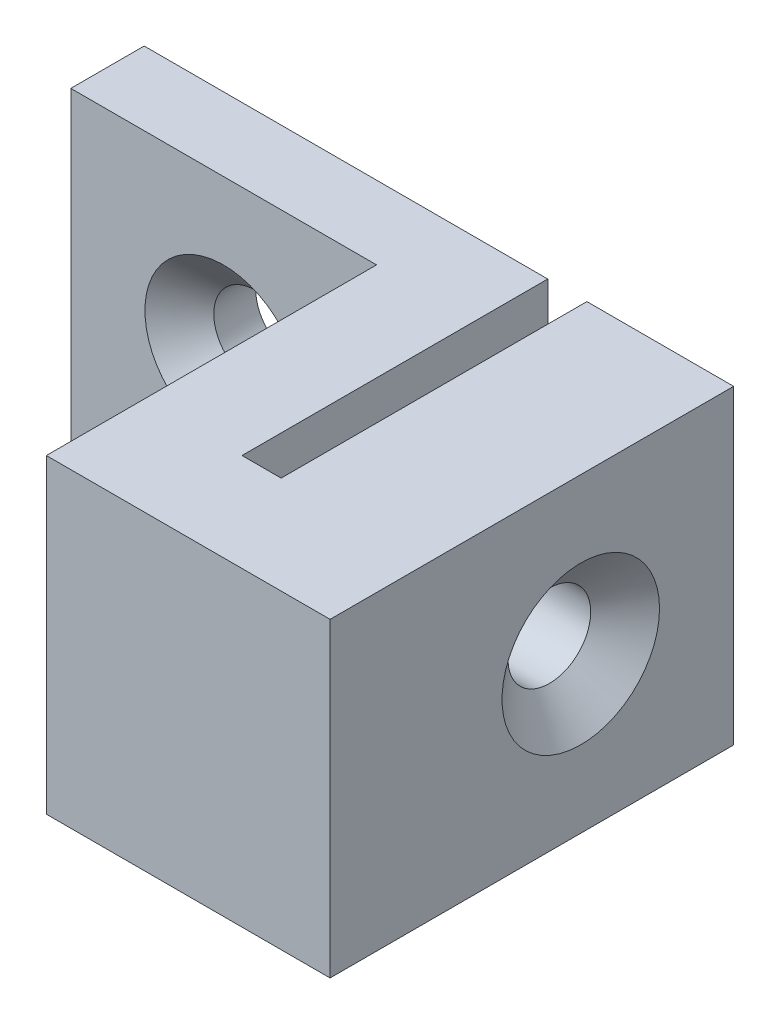
ISO-10303-21;
HEADER;
FILE_DESCRIPTION(('STEP AP214'),'2;1');
FILE_NAME('part.step','',(''),(''),'','','');
FILE_SCHEMA(('AUTOMOTIVE_DESIGN { 1 0 10303 214 1 1 1 1 }'));
ENDSEC;
DATA;
#1=APPLICATION_CONTEXT('core data for automotive mechanical design processes');
#2=APPLICATION_PROTOCOL_DEFINITION('international standard','automotive_design',2000,#1);
#3=PRODUCT_CONTEXT('',#1,'mechanical');
#4=PRODUCT('Part','Part','',(#3));
#5=PRODUCT_RELATED_PRODUCT_CATEGORY('part','',(#4));
#6=PRODUCT_DEFINITION_FORMATION('','',#4);
#7=PRODUCT_DEFINITION_CONTEXT('part definition',#1,'design');
#8=PRODUCT_DEFINITION('design','',#6,#7);
#9=PRODUCT_DEFINITION_SHAPE('','',#8);
#10=(LENGTH_UNIT() NAMED_UNIT(*) SI_UNIT(.MILLI.,.METRE.));
#11=(NAMED_UNIT(*) PLANE_ANGLE_UNIT() SI_UNIT($,.RADIAN.));
#12=(NAMED_UNIT(*) SI_UNIT($,.STERADIAN.) SOLID_ANGLE_UNIT());
#13=UNCERTAINTY_MEASURE_WITH_UNIT(LENGTH_MEASURE(1.E-05),#10,'distance_accuracy_value','');
#14=(GEOMETRIC_REPRESENTATION_CONTEXT(3) GLOBAL_UNCERTAINTY_ASSIGNED_CONTEXT((#13)) GLOBAL_UNIT_ASSIGNED_CONTEXT((#10,
#11,#12)) REPRESENTATION_CONTEXT('',''));
#15=CARTESIAN_POINT('',(0.,0.,0.));
#16=DIRECTION('',(0.,0.,1.));
#17=DIRECTION('',(1.,0.,0.));
#18=AXIS2_PLACEMENT_3D('',#15,#16,#17);
#19=CARTESIAN_POINT('',(13.6,25.4,8.));
#20=DIRECTION('',(0.,0.,-1.));
#21=DIRECTION('',(-1.,0.,0.));
#22=AXIS2_PLACEMENT_3D('',#19,#20,#21);
#23=PLANE('',#22);
#24=DIRECTION('',(1.,0.,0.));
#25=VECTOR('',#24,1.);
#26=CARTESIAN_POINT('',(13.6,0.,8.));
#27=LINE('',#26,#25);
#28=CARTESIAN_POINT('',(-9.6,0.,8.));
#29=VERTEX_POINT('',#28);
#30=CARTESIAN_POINT('',(13.6,0.,8.));
#31=VERTEX_POINT('',#30);
#32=EDGE_CURVE('E147',#29,#31,#27,.T.);
#33=ORIENTED_EDGE('',*,*,#32,.T.);
#34=DIRECTION('',(0.,-1.,0.));
#35=VECTOR('',#34,1.);
#36=CARTESIAN_POINT('',(13.6,25.4,8.));
#37=LINE('',#36,#35);
#38=CARTESIAN_POINT('',(13.6,25.4,8.));
#39=VERTEX_POINT('',#38);
#40=EDGE_CURVE('E11',#39,#31,#37,.T.);
#41=ORIENTED_EDGE('',*,*,#40,.F.);
#42=DIRECTION('',(1.,0.,0.));
#43=VECTOR('',#42,1.);
#44=CARTESIAN_POINT('',(13.6,25.4,8.));
#45=LINE('',#44,#43);
#46=CARTESIAN_POINT('',(-9.6,25.4,8.));
#47=VERTEX_POINT('',#46);
#48=EDGE_CURVE('E166',#47,#39,#45,.T.);
#49=ORIENTED_EDGE('',*,*,#48,.F.);
#50=DIRECTION('',(0.,-1.,0.));
#51=VECTOR('',#50,1.);
#52=CARTESIAN_POINT('',(-9.6,25.4,8.));
#53=LINE('',#52,#51);
#54=EDGE_CURVE('E143',#47,#29,#53,.T.);
#55=ORIENTED_EDGE('',*,*,#54,.T.);
#56=EDGE_LOOP('',(#33,#41,#49,#55));
#57=FACE_BOUND('',#56,.T.);
#58=ADVANCED_FACE('F37',(#57),#23,.F.);
#59=CARTESIAN_POINT('',(13.6,25.4,-25.));
#60=DIRECTION('',(-1.,0.,0.));
#61=DIRECTION('',(0.,0.,1.));
#62=AXIS2_PLACEMENT_3D('',#59,#60,#61);
#63=PLANE('',#62);
#64=CARTESIAN_POINT('',(13.6,12.7,-12.5));
#65=DIRECTION('',(1.,0.,0.));
#66=DIRECTION('',(0.,0.,-1.));
#67=AXIS2_PLACEMENT_3D('',#64,#65,#66);
#68=CIRCLE('',#67,6.4389);
#69=CARTESIAN_POINT('',(13.6,12.7,-18.9389));
#70=VERTEX_POINT('',#69);
#71=EDGE_CURVE('E422',#70,#70,#68,.T.);
#72=ORIENTED_EDGE('',*,*,#71,.F.);
#73=EDGE_LOOP('',(#72));
#74=FACE_BOUND('',#73,.T.);
#75=DIRECTION('',(0.,0.,-1.));
#76=VECTOR('',#75,1.);
#77=CARTESIAN_POINT('',(13.6,0.,-25.));
#78=LINE('',#77,#76);
#79=CARTESIAN_POINT('',(13.6,0.,-25.));
#80=VERTEX_POINT('',#79);
#81=EDGE_CURVE('E150',#31,#80,#78,.T.);
#82=ORIENTED_EDGE('',*,*,#81,.T.);
#83=DIRECTION('',(0.,-1.,0.));
#84=VECTOR('',#83,1.);
#85=CARTESIAN_POINT('',(13.6,25.4,-25.));
#86=LINE('',#85,#84);
#87=CARTESIAN_POINT('',(13.6,25.4,-25.));
#88=VERTEX_POINT('',#87);
#89=EDGE_CURVE('E46',#88,#80,#86,.T.);
#90=ORIENTED_EDGE('',*,*,#89,.F.);
#91=DIRECTION('',(0.,0.,-1.));
#92=VECTOR('',#91,1.);
#93=CARTESIAN_POINT('',(13.6,25.4,-25.));
#94=LINE('',#93,#92);
#95=EDGE_CURVE('E104',#39,#88,#94,.T.);
#96=ORIENTED_EDGE('',*,*,#95,.F.);
#97=ORIENTED_EDGE('',*,*,#40,.T.);
#98=EDGE_LOOP('',(#82,#90,#96,#97));
#99=FACE_BOUND('',#98,.T.);
#100=ADVANCED_FACE('F240',(#74,#99),#63,.F.);
#101=CARTESIAN_POINT('',(1.6,25.4,-25.));
#102=DIRECTION('',(0.,0.,1.));
#103=DIRECTION('',(1.,0.,0.));
#104=AXIS2_PLACEMENT_3D('',#101,#102,#103);
#105=PLANE('',#104);
#106=DIRECTION('',(-1.,0.,0.));
#107=VECTOR('',#106,1.);
#108=CARTESIAN_POINT('',(1.6,0.,-25.));
#109=LINE('',#108,#107);
#110=CARTESIAN_POINT('',(1.6,0.,-25.));
#111=VERTEX_POINT('',#110);
#112=EDGE_CURVE('E153',#80,#111,#109,.T.);
#113=ORIENTED_EDGE('',*,*,#112,.T.);
#114=DIRECTION('',(0.,-1.,0.));
#115=VECTOR('',#114,1.);
#116=CARTESIAN_POINT('',(1.6,25.4,-25.));
#117=LINE('',#116,#115);
#118=CARTESIAN_POINT('',(1.6,25.4,-25.));
#119=VERTEX_POINT('',#118);
#120=EDGE_CURVE('E179',#119,#111,#117,.T.);
#121=ORIENTED_EDGE('',*,*,#120,.F.);
#122=DIRECTION('',(-1.,0.,0.));
#123=VECTOR('',#122,1.);
#124=CARTESIAN_POINT('',(1.6,25.4,-25.));
#125=LINE('',#124,#123);
#126=EDGE_CURVE('E203',#88,#119,#125,.T.);
#127=ORIENTED_EDGE('',*,*,#126,.F.);
#128=ORIENTED_EDGE('',*,*,#89,.T.);
#129=EDGE_LOOP('',(#113,#121,#127,#128));
#130=FACE_BOUND('',#129,.T.);
#131=ADVANCED_FACE('F244',(#130),#105,.F.);
#132=CARTESIAN_POINT('',(1.6,25.4,0.));
#133=DIRECTION('',(1.,0.,0.));
#134=DIRECTION('',(0.,0.,-1.));
#135=AXIS2_PLACEMENT_3D('',#132,#133,#134);
#136=PLANE('',#135);
#137=CARTESIAN_POINT('',(1.6,12.7,-12.5));
#138=DIRECTION('',(1.,0.,0.));
#139=DIRECTION('',(0.,0.,-1.));
#140=AXIS2_PLACEMENT_3D('',#137,#138,#139);
#141=CIRCLE('',#140,3.3782);
#142=CARTESIAN_POINT('',(1.6,12.7,-15.8782));
#143=VERTEX_POINT('',#142);
#144=EDGE_CURVE('E186',#143,#143,#141,.T.);
#145=ORIENTED_EDGE('',*,*,#144,.T.);
#146=EDGE_LOOP('',(#145));
#147=FACE_BOUND('',#146,.T.);
#148=DIRECTION('',(0.,0.,1.));
#149=VECTOR('',#148,1.);
#150=CARTESIAN_POINT('',(1.6,0.,0.));
#151=LINE('',#150,#149);
#152=CARTESIAN_POINT('',(1.6,0.,0.));
#153=VERTEX_POINT('',#152);
#154=EDGE_CURVE('E155',#111,#153,#151,.T.);
#155=ORIENTED_EDGE('',*,*,#154,.T.);
#156=DIRECTION('',(0.,-1.,0.));
#157=VECTOR('',#156,1.);
#158=CARTESIAN_POINT('',(1.6,25.4,0.));
#159=LINE('',#158,#157);
#160=CARTESIAN_POINT('',(1.6,25.4,0.));
#161=VERTEX_POINT('',#160);
#162=EDGE_CURVE('E176',#161,#153,#159,.T.);
#163=ORIENTED_EDGE('',*,*,#162,.F.);
#164=DIRECTION('',(0.,0.,1.));
#165=VECTOR('',#164,1.);
#166=CARTESIAN_POINT('',(1.6,25.4,0.));
#167=LINE('',#166,#165);
#168=EDGE_CURVE('E205',#119,#161,#167,.T.);
#169=ORIENTED_EDGE('',*,*,#168,.F.);
#170=ORIENTED_EDGE('',*,*,#120,.T.);
#171=EDGE_LOOP('',(#155,#163,#169,#170));
#172=FACE_BOUND('',#171,.T.);
#173=ADVANCED_FACE('F249',(#147,#172),#136,.F.);
#174=CARTESIAN_POINT('',(-1.6,25.4,0.));
#175=DIRECTION('',(0.,0.,1.));
#176=DIRECTION('',(1.,0.,0.));
#177=AXIS2_PLACEMENT_3D('',#174,#175,#176);
#178=PLANE('',#177);
#179=DIRECTION('',(-1.,0.,0.));
#180=VECTOR('',#179,1.);
#181=CARTESIAN_POINT('',(-1.6,0.,0.));
#182=LINE('',#181,#180);
#183=CARTESIAN_POINT('',(-1.6,0.,0.));
#184=VERTEX_POINT('',#183);
#185=EDGE_CURVE('E157',#153,#184,#182,.T.);
#186=ORIENTED_EDGE('',*,*,#185,.T.);
#187=DIRECTION('',(0.,-1.,0.));
#188=VECTOR('',#187,1.);
#189=CARTESIAN_POINT('',(-1.6,25.4,0.));
#190=LINE('',#189,#188);
#191=CARTESIAN_POINT('',(-1.6,25.4,0.));
#192=VERTEX_POINT('',#191);
#193=EDGE_CURVE('E173',#192,#184,#190,.T.);
#194=ORIENTED_EDGE('',*,*,#193,.F.);
#195=DIRECTION('',(-1.,0.,0.));
#196=VECTOR('',#195,1.);
#197=CARTESIAN_POINT('',(-1.6,25.4,0.));
#198=LINE('',#197,#196);
#199=EDGE_CURVE('E207',#161,#192,#198,.T.);
#200=ORIENTED_EDGE('',*,*,#199,.F.);
#201=ORIENTED_EDGE('',*,*,#162,.T.);
#202=EDGE_LOOP('',(#186,#194,#200,#201));
#203=FACE_BOUND('',#202,.T.);
#204=ADVANCED_FACE('F256',(#203),#178,.F.);
#205=CARTESIAN_POINT('',(-1.6,25.4,-25.));
#206=DIRECTION('',(-1.,0.,0.));
#207=DIRECTION('',(0.,0.,1.));
#208=AXIS2_PLACEMENT_3D('',#205,#206,#207);
#209=PLANE('',#208);
#210=CARTESIAN_POINT('',(-1.6,12.7,-12.5));
#211=DIRECTION('',(-1.,0.,0.));
#212=DIRECTION('',(0.,0.,1.));
#213=AXIS2_PLACEMENT_3D('',#210,#211,#212);
#214=CIRCLE('',#213,3.3782);
#215=CARTESIAN_POINT('',(-1.6,12.7,-9.1218));
#216=VERTEX_POINT('',#215);
#217=EDGE_CURVE('E184',#216,#216,#214,.T.);
#218=ORIENTED_EDGE('',*,*,#217,.T.);
#219=EDGE_LOOP('',(#218));
#220=FACE_BOUND('',#219,.T.);
#221=DIRECTION('',(0.,0.,-1.));
#222=VECTOR('',#221,1.);
#223=CARTESIAN_POINT('',(-1.6,0.,-25.));
#224=LINE('',#223,#222);
#225=CARTESIAN_POINT('',(-1.6,0.,-25.));
#226=VERTEX_POINT('',#225);
#227=EDGE_CURVE('E159',#184,#226,#224,.T.);
#228=ORIENTED_EDGE('',*,*,#227,.T.);
#229=DIRECTION('',(0.,-1.,0.));
#230=VECTOR('',#229,1.);
#231=CARTESIAN_POINT('',(-1.6,25.4,-25.));
#232=LINE('',#231,#230);
#233=CARTESIAN_POINT('',(-1.6,25.4,-25.));
#234=VERTEX_POINT('',#233);
#235=EDGE_CURVE('E170',#234,#226,#232,.T.);
#236=ORIENTED_EDGE('',*,*,#235,.F.);
#237=DIRECTION('',(0.,0.,-1.));
#238=VECTOR('',#237,1.);
#239=CARTESIAN_POINT('',(-1.6,25.4,-25.));
#240=LINE('',#239,#238);
#241=EDGE_CURVE('E209',#192,#234,#240,.T.);
#242=ORIENTED_EDGE('',*,*,#241,.F.);
#243=ORIENTED_EDGE('',*,*,#193,.T.);
#244=EDGE_LOOP('',(#228,#236,#242,#243));
#245=FACE_BOUND('',#244,.T.);
#246=ADVANCED_FACE('F215',(#220,#245),#209,.F.);
#247=CARTESIAN_POINT('',(-34.6,25.4,-25.));
#248=DIRECTION('',(0.,0.,1.));
#249=DIRECTION('',(1.,0.,0.));
#250=AXIS2_PLACEMENT_3D('',#247,#248,#249);
#251=PLANE('',#250);
#252=CARTESIAN_POINT('',(-22.1,12.7,-25.));
#253=DIRECTION('',(0.,0.,1.));
#254=DIRECTION('',(1.,0.,0.));
#255=AXIS2_PLACEMENT_3D('',#252,#253,#254);
#256=CIRCLE('',#255,3.37819999999999);
#257=CARTESIAN_POINT('',(-18.7218,12.7,-25.));
#258=VERTEX_POINT('',#257);
#259=EDGE_CURVE('E40',#258,#258,#256,.T.);
#260=ORIENTED_EDGE('',*,*,#259,.T.);
#261=EDGE_LOOP('',(#260));
#262=FACE_BOUND('',#261,.T.);
#263=DIRECTION('',(-1.,0.,0.));
#264=VECTOR('',#263,1.);
#265=CARTESIAN_POINT('',(-34.6,0.,-25.));
#266=LINE('',#265,#264);
#267=CARTESIAN_POINT('',(-34.6,0.,-25.));
#268=VERTEX_POINT('',#267);
#269=EDGE_CURVE('E161',#226,#268,#266,.T.);
#270=ORIENTED_EDGE('',*,*,#269,.T.);
#271=DIRECTION('',(0.,-1.,0.));
#272=VECTOR('',#271,1.);
#273=CARTESIAN_POINT('',(-34.6,25.4,-25.));
#274=LINE('',#273,#272);
#275=CARTESIAN_POINT('',(-34.6,25.4,-25.));
#276=VERTEX_POINT('',#275);
#277=EDGE_CURVE('E138',#276,#268,#274,.T.);
#278=ORIENTED_EDGE('',*,*,#277,.F.);
#279=DIRECTION('',(-1.,0.,0.));
#280=VECTOR('',#279,1.);
#281=CARTESIAN_POINT('',(-34.6,25.4,-25.));
#282=LINE('',#281,#280);
#283=EDGE_CURVE('E129',#234,#276,#282,.T.);
#284=ORIENTED_EDGE('',*,*,#283,.F.);
#285=ORIENTED_EDGE('',*,*,#235,.T.);
#286=EDGE_LOOP('',(#270,#278,#284,#285));
#287=FACE_BOUND('',#286,.T.);
#288=ADVANCED_FACE('F219',(#262,#287),#251,.F.);
#289=CARTESIAN_POINT('',(-34.6,25.4,-19.));
#290=DIRECTION('',(1.,0.,0.));
#291=DIRECTION('',(0.,0.,-1.));
#292=AXIS2_PLACEMENT_3D('',#289,#290,#291);
#293=PLANE('',#292);
#294=DIRECTION('',(0.,0.,1.));
#295=VECTOR('',#294,1.);
#296=CARTESIAN_POINT('',(-34.6,0.,-19.));
#297=LINE('',#296,#295);
#298=CARTESIAN_POINT('',(-34.6,0.,-19.));
#299=VERTEX_POINT('',#298);
#300=EDGE_CURVE('E137',#268,#299,#297,.T.);
#301=ORIENTED_EDGE('',*,*,#300,.T.);
#302=DIRECTION('',(0.,-1.,0.));
#303=VECTOR('',#302,1.);
#304=CARTESIAN_POINT('',(-34.6,25.4,-19.));
#305=LINE('',#304,#303);
#306=CARTESIAN_POINT('',(-34.6,25.4,-19.));
#307=VERTEX_POINT('',#306);
#308=EDGE_CURVE('E134',#307,#299,#305,.T.);
#309=ORIENTED_EDGE('',*,*,#308,.F.);
#310=DIRECTION('',(0.,0.,1.));
#311=VECTOR('',#310,1.);
#312=CARTESIAN_POINT('',(-34.6,25.4,-19.));
#313=LINE('',#312,#311);
#314=EDGE_CURVE('E123',#276,#307,#313,.T.);
#315=ORIENTED_EDGE('',*,*,#314,.F.);
#316=ORIENTED_EDGE('',*,*,#277,.T.);
#317=EDGE_LOOP('',(#301,#309,#315,#316));
#318=FACE_BOUND('',#317,.T.);
#319=ADVANCED_FACE('F135',(#318),#293,.F.);
#320=CARTESIAN_POINT('',(-9.6,25.4,-19.));
#321=DIRECTION('',(0.,0.,-1.));
#322=DIRECTION('',(-1.,0.,0.));
#323=AXIS2_PLACEMENT_3D('',#320,#321,#322);
#324=PLANE('',#323);
#325=CARTESIAN_POINT('',(-22.1,12.7,-19.));
#326=DIRECTION('',(0.,0.,1.));
#327=DIRECTION('',(1.,0.,0.));
#328=AXIS2_PLACEMENT_3D('',#325,#326,#327);
#329=CIRCLE('',#328,6.4389);
#330=CARTESIAN_POINT('',(-15.6611,12.7,-19.));
#331=VERTEX_POINT('',#330);
#332=EDGE_CURVE('E430',#331,#331,#329,.T.);
#333=ORIENTED_EDGE('',*,*,#332,.F.);
#334=EDGE_LOOP('',(#333));
#335=FACE_BOUND('',#334,.T.);
#336=DIRECTION('',(1.,0.,0.));
#337=VECTOR('',#336,1.);
#338=CARTESIAN_POINT('',(-9.6,0.,-19.));
#339=LINE('',#338,#337);
#340=CARTESIAN_POINT('',(-9.6,0.,-19.));
#341=VERTEX_POINT('',#340);
#342=EDGE_CURVE('E90',#299,#341,#339,.T.);
#343=ORIENTED_EDGE('',*,*,#342,.T.);
#344=DIRECTION('',(0.,-1.,0.));
#345=VECTOR('',#344,1.);
#346=CARTESIAN_POINT('',(-9.6,25.4,-19.));
#347=LINE('',#346,#345);
#348=CARTESIAN_POINT('',(-9.6,25.4,-19.));
#349=VERTEX_POINT('',#348);
#350=EDGE_CURVE('E139',#349,#341,#347,.T.);
#351=ORIENTED_EDGE('',*,*,#350,.F.);
#352=DIRECTION('',(1.,0.,0.));
#353=VECTOR('',#352,1.);
#354=CARTESIAN_POINT('',(-9.6,25.4,-19.));
#355=LINE('',#354,#353);
#356=EDGE_CURVE('E127',#307,#349,#355,.T.);
#357=ORIENTED_EDGE('',*,*,#356,.F.);
#358=ORIENTED_EDGE('',*,*,#308,.T.);
#359=EDGE_LOOP('',(#343,#351,#357,#358));
#360=FACE_BOUND('',#359,.T.);
#361=ADVANCED_FACE('F141',(#335,#360),#324,.F.);
#362=CARTESIAN_POINT('',(-9.6,25.4,8.));
#363=DIRECTION('',(1.,0.,0.));
#364=DIRECTION('',(0.,0.,-1.));
#365=AXIS2_PLACEMENT_3D('',#362,#363,#364);
#366=PLANE('',#365);
#367=CARTESIAN_POINT('',(-9.6,12.7,-12.5));
#368=DIRECTION('',(1.,0.,0.));
#369=DIRECTION('',(0.,0.,-1.));
#370=AXIS2_PLACEMENT_3D('',#367,#368,#369);
#371=CIRCLE('',#370,2.5527);
#372=CARTESIAN_POINT('',(-9.6,12.7,-15.0527));
#373=VERTEX_POINT('',#372);
#374=EDGE_CURVE('E151',#373,#373,#371,.T.);
#375=ORIENTED_EDGE('',*,*,#374,.T.);
#376=EDGE_LOOP('',(#375));
#377=FACE_BOUND('',#376,.T.);
#378=DIRECTION('',(0.,0.,1.));
#379=VECTOR('',#378,1.);
#380=CARTESIAN_POINT('',(-9.6,0.,8.));
#381=LINE('',#380,#379);
#382=EDGE_CURVE('E96',#341,#29,#381,.T.);
#383=ORIENTED_EDGE('',*,*,#382,.T.);
#384=ORIENTED_EDGE('',*,*,#54,.F.);
#385=DIRECTION('',(0.,0.,1.));
#386=VECTOR('',#385,1.);
#387=CARTESIAN_POINT('',(-9.6,25.4,8.));
#388=LINE('',#387,#386);
#389=EDGE_CURVE('E55',#349,#47,#388,.T.);
#390=ORIENTED_EDGE('',*,*,#389,.F.);
#391=ORIENTED_EDGE('',*,*,#350,.T.);
#392=EDGE_LOOP('',(#383,#384,#390,#391));
#393=FACE_BOUND('',#392,.T.);
#394=ADVANCED_FACE('F227',(#377,#393),#366,.F.);
#395=CARTESIAN_POINT('',(0.,25.4,0.));
#396=DIRECTION('',(0.,-1.,0.));
#397=DIRECTION('',(0.,0.,-1.));
#398=AXIS2_PLACEMENT_3D('',#395,#396,#397);
#399=PLANE('',#398);
#400=ORIENTED_EDGE('',*,*,#48,.T.);
#401=ORIENTED_EDGE('',*,*,#95,.T.);
#402=ORIENTED_EDGE('',*,*,#126,.T.);
#403=ORIENTED_EDGE('',*,*,#168,.T.);
#404=ORIENTED_EDGE('',*,*,#199,.T.);
#405=ORIENTED_EDGE('',*,*,#241,.T.);
#406=ORIENTED_EDGE('',*,*,#283,.T.);
#407=ORIENTED_EDGE('',*,*,#314,.T.);
#408=ORIENTED_EDGE('',*,*,#356,.T.);
#409=ORIENTED_EDGE('',*,*,#389,.T.);
#410=EDGE_LOOP('',(#400,#401,#402,#403,#404,#405,#406,#407,#408,#409));
#411=FACE_BOUND('',#410,.T.);
#412=ADVANCED_FACE('F125',(#411),#399,.F.);
#413=CARTESIAN_POINT('',(0.,0.,0.));
#414=DIRECTION('',(0.,-1.,0.));
#415=DIRECTION('',(0.,0.,-1.));
#416=AXIS2_PLACEMENT_3D('',#413,#414,#415);
#417=PLANE('',#416);
#418=ORIENTED_EDGE('',*,*,#32,.F.);
#419=ORIENTED_EDGE('',*,*,#382,.F.);
#420=ORIENTED_EDGE('',*,*,#342,.F.);
#421=ORIENTED_EDGE('',*,*,#300,.F.);
#422=ORIENTED_EDGE('',*,*,#269,.F.);
#423=ORIENTED_EDGE('',*,*,#227,.F.);
#424=ORIENTED_EDGE('',*,*,#185,.F.);
#425=ORIENTED_EDGE('',*,*,#154,.F.);
#426=ORIENTED_EDGE('',*,*,#112,.F.);
#427=ORIENTED_EDGE('',*,*,#81,.F.);
#428=EDGE_LOOP('',(#418,#419,#420,#421,#422,#423,#424,#425,#426,#427));
#429=FACE_BOUND('',#428,.T.);
#430=ADVANCED_FACE('F222',(#429),#417,.T.);
#431=CARTESIAN_POINT('',(-1.6,12.7,-12.5));
#432=DIRECTION('',(1.,0.,0.));
#433=DIRECTION('',(0.,0.,-1.));
#434=AXIS2_PLACEMENT_3D('',#431,#432,#433);
#435=CYLINDRICAL_SURFACE('',#434,2.5527);
#436=CARTESIAN_POINT('',(-3.40601044100725,12.7,-12.5));
#437=DIRECTION('',(1.,0.,0.));
#438=DIRECTION('',(0.,0.,-1.));
#439=AXIS2_PLACEMENT_3D('',#436,#437,#438);
#440=CIRCLE('',#439,2.5527);
#441=CARTESIAN_POINT('',(-3.40601044100725,12.7,-15.0527));
#442=VERTEX_POINT('',#441);
#443=EDGE_CURVE('E188',#442,#442,#440,.T.);
#444=ORIENTED_EDGE('',*,*,#443,.T.);
#445=EDGE_LOOP('',(#444));
#446=FACE_BOUND('',#445,.T.);
#447=ORIENTED_EDGE('',*,*,#374,.F.);
#448=EDGE_LOOP('',(#447));
#449=FACE_BOUND('',#448,.T.);
#450=ADVANCED_FACE('F322',(#446,#449),#435,.F.);
#451=CARTESIAN_POINT('',(13.6,12.7,-12.5));
#452=DIRECTION('',(1.,0.,0.));
#453=DIRECTION('',(0.,0.,-1.));
#454=AXIS2_PLACEMENT_3D('',#451,#452,#453);
#455=CYLINDRICAL_SURFACE('',#454,3.3782);
#456=CARTESIAN_POINT('',(-2.91,12.7,-12.5));
#457=DIRECTION('',(1.,0.,0.));
#458=DIRECTION('',(0.,0.,-1.));
#459=AXIS2_PLACEMENT_3D('',#456,#457,#458);
#460=CIRCLE('',#459,3.37819999999999);
#461=CARTESIAN_POINT('',(-2.91,12.7,-15.8782));
#462=VERTEX_POINT('',#461);
#463=EDGE_CURVE('E187',#462,#462,#460,.T.);
#464=ORIENTED_EDGE('',*,*,#463,.F.);
#465=EDGE_LOOP('',(#464));
#466=FACE_BOUND('',#465,.T.);
#467=ORIENTED_EDGE('',*,*,#217,.F.);
#468=EDGE_LOOP('',(#467));
#469=FACE_BOUND('',#468,.T.);
#470=ADVANCED_FACE('F318',(#466,#469),#455,.F.);
#471=CARTESIAN_POINT('',(-2.91,12.7,-12.5));
#472=DIRECTION('',(1.,0.,0.));
#473=DIRECTION('',(0.,0.,-1.));
#474=AXIS2_PLACEMENT_3D('',#471,#472,#473);
#475=CONICAL_SURFACE('',#474,3.37819999999999,1.02974425867665);
#476=ORIENTED_EDGE('',*,*,#463,.T.);
#477=EDGE_LOOP('',(#476));
#478=FACE_BOUND('',#477,.T.);
#479=ORIENTED_EDGE('',*,*,#443,.F.);
#480=EDGE_LOOP('',(#479));
#481=FACE_BOUND('',#480,.T.);
#482=ADVANCED_FACE('F316',(#478,#481),#475,.F.);
#483=CARTESIAN_POINT('',(11.0317677588557,12.7,-12.5));
#484=DIRECTION('',(1.,0.,0.));
#485=DIRECTION('',(0.,0.,-1.));
#486=AXIS2_PLACEMENT_3D('',#483,#484,#485);
#487=CIRCLE('',#486,3.3782);
#488=CARTESIAN_POINT('',(11.0317677588557,12.7,-15.8782));
#489=VERTEX_POINT('',#488);
#490=EDGE_CURVE('E420',#489,#489,#487,.T.);
#491=ORIENTED_EDGE('',*,*,#490,.T.);
#492=EDGE_LOOP('',(#491));
#493=FACE_BOUND('',#492,.T.);
#494=ORIENTED_EDGE('',*,*,#144,.F.);
#495=EDGE_LOOP('',(#494));
#496=FACE_BOUND('',#495,.T.);
#497=ADVANCED_FACE('F312',(#493,#496),#455,.F.);
#498=CARTESIAN_POINT('',(13.6,12.7,-12.5));
#499=DIRECTION('',(1.,0.,0.));
#500=DIRECTION('',(0.,0.,-1.));
#501=AXIS2_PLACEMENT_3D('',#498,#499,#500);
#502=CONICAL_SURFACE('',#501,6.4389,0.872664625997164);
#503=ORIENTED_EDGE('',*,*,#490,.F.);
#504=EDGE_LOOP('',(#503));
#505=FACE_BOUND('',#504,.T.);
#506=ORIENTED_EDGE('',*,*,#71,.T.);
#507=EDGE_LOOP('',(#506));
#508=FACE_BOUND('',#507,.T.);
#509=ADVANCED_FACE('F292',(#505,#508),#502,.F.);
#510=CARTESIAN_POINT('',(-22.1,12.7,-19.));
#511=DIRECTION('',(0.,0.,1.));
#512=DIRECTION('',(1.,0.,0.));
#513=AXIS2_PLACEMENT_3D('',#510,#511,#512);
#514=CYLINDRICAL_SURFACE('',#513,3.37819999999999);
#515=CARTESIAN_POINT('',(-22.1,12.7,-21.5682322411443));
#516=DIRECTION('',(0.,0.,1.));
#517=DIRECTION('',(1.,0.,0.));
#518=AXIS2_PLACEMENT_3D('',#515,#516,#517);
#519=CIRCLE('',#518,3.37819999999999);
#520=CARTESIAN_POINT('',(-18.7218,12.7,-21.5682322411443));
#521=VERTEX_POINT('',#520);
#522=EDGE_CURVE('E427',#521,#521,#519,.T.);
#523=ORIENTED_EDGE('',*,*,#522,.T.);
#524=EDGE_LOOP('',(#523));
#525=FACE_BOUND('',#524,.T.);
#526=ORIENTED_EDGE('',*,*,#259,.F.);
#527=EDGE_LOOP('',(#526));
#528=FACE_BOUND('',#527,.T.);
#529=ADVANCED_FACE('F286',(#525,#528),#514,.F.);
#530=CARTESIAN_POINT('',(-22.1,12.7,-19.));
#531=DIRECTION('',(0.,0.,1.));
#532=DIRECTION('',(1.,0.,0.));
#533=AXIS2_PLACEMENT_3D('',#530,#531,#532);
#534=CONICAL_SURFACE('',#533,6.4389,0.872664625997164);
#535=ORIENTED_EDGE('',*,*,#522,.F.);
#536=EDGE_LOOP('',(#535));
#537=FACE_BOUND('',#536,.T.);
#538=ORIENTED_EDGE('',*,*,#332,.T.);
#539=EDGE_LOOP('',(#538));
#540=FACE_BOUND('',#539,.T.);
#541=ADVANCED_FACE('F291',(#537,#540),#534,.F.);
#542=CLOSED_SHELL('',(#58,#100,#131,#173,#204,#246,#288,#319,#361,#394,#412,#430,#450,#470,#482,
#497,#509,#529,#541));
#543=MANIFOLD_SOLID_BREP('B2',#542);
#544=ADVANCED_BREP_SHAPE_REPRESENTATION('',(#18,#543),#14);
#545=SHAPE_DEFINITION_REPRESENTATION(#9,#544);
ENDSEC;
END-ISO-10303-21;
